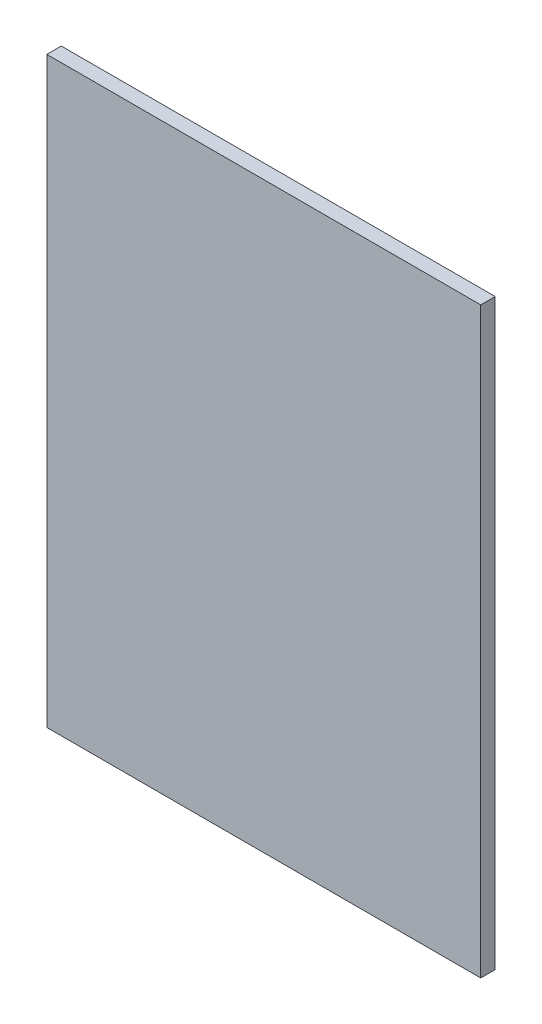
ISO-10303-21;
HEADER;
FILE_DESCRIPTION(('STEP AP214'),'2;1');
FILE_NAME('part.step','',(''),(''),'','','');
FILE_SCHEMA(('AUTOMOTIVE_DESIGN { 1 0 10303 214 1 1 1 1 }'));
ENDSEC;
DATA;
#1=APPLICATION_CONTEXT('core data for automotive mechanical design processes');
#2=APPLICATION_PROTOCOL_DEFINITION('international standard','automotive_design',2000,#1);
#3=PRODUCT_CONTEXT('',#1,'mechanical');
#4=PRODUCT('Part','Part','',(#3));
#5=PRODUCT_RELATED_PRODUCT_CATEGORY('part','',(#4));
#6=PRODUCT_DEFINITION_FORMATION('','',#4);
#7=PRODUCT_DEFINITION_CONTEXT('part definition',#1,'design');
#8=PRODUCT_DEFINITION('design','',#6,#7);
#9=PRODUCT_DEFINITION_SHAPE('','',#8);
#10=(LENGTH_UNIT() NAMED_UNIT(*) SI_UNIT(.MILLI.,.METRE.));
#11=(NAMED_UNIT(*) PLANE_ANGLE_UNIT() SI_UNIT($,.RADIAN.));
#12=(NAMED_UNIT(*) SI_UNIT($,.STERADIAN.) SOLID_ANGLE_UNIT());
#13=UNCERTAINTY_MEASURE_WITH_UNIT(LENGTH_MEASURE(1.E-05),#10,'distance_accuracy_value','');
#14=(GEOMETRIC_REPRESENTATION_CONTEXT(3) GLOBAL_UNCERTAINTY_ASSIGNED_CONTEXT((#13)) GLOBAL_UNIT_ASSIGNED_CONTEXT((#10,
#11,#12)) REPRESENTATION_CONTEXT('',''));
#15=CARTESIAN_POINT('',(0.,0.,0.));
#16=DIRECTION('',(0.,0.,1.));
#17=DIRECTION('',(1.,0.,0.));
#18=AXIS2_PLACEMENT_3D('',#15,#16,#17);
#19=CARTESIAN_POINT('',(-38.1,51.181,2.54));
#20=DIRECTION('',(1.,0.,0.));
#21=DIRECTION('',(0.,0.,-1.));
#22=AXIS2_PLACEMENT_3D('',#19,#20,#21);
#23=PLANE('',#22);
#24=DIRECTION('',(0.,-1.,0.));
#25=VECTOR('',#24,1.);
#26=CARTESIAN_POINT('',(-38.1,51.181,0.));
#27=LINE('',#26,#25);
#28=CARTESIAN_POINT('',(-38.1,51.181,0.));
#29=VERTEX_POINT('',#28);
#30=CARTESIAN_POINT('',(-38.1,-51.181,0.));
#31=VERTEX_POINT('',#30);
#32=EDGE_CURVE('E98',#29,#31,#27,.T.);
#33=ORIENTED_EDGE('',*,*,#32,.T.);
#34=DIRECTION('',(0.,0.,-1.));
#35=VECTOR('',#34,1.);
#36=CARTESIAN_POINT('',(-38.1,-51.181,2.54));
#37=LINE('',#36,#35);
#38=CARTESIAN_POINT('',(-38.1,-51.181,2.54));
#39=VERTEX_POINT('',#38);
#40=EDGE_CURVE('E11',#39,#31,#37,.T.);
#41=ORIENTED_EDGE('',*,*,#40,.F.);
#42=DIRECTION('',(0.,-1.,0.));
#43=VECTOR('',#42,1.);
#44=CARTESIAN_POINT('',(-38.1,51.181,2.54));
#45=LINE('',#44,#43);
#46=CARTESIAN_POINT('',(-38.1,51.181,2.54));
#47=VERTEX_POINT('',#46);
#48=EDGE_CURVE('E86',#47,#39,#45,.T.);
#49=ORIENTED_EDGE('',*,*,#48,.F.);
#50=DIRECTION('',(0.,0.,-1.));
#51=VECTOR('',#50,1.);
#52=CARTESIAN_POINT('',(-38.1,51.181,2.54));
#53=LINE('',#52,#51);
#54=EDGE_CURVE('E94',#47,#29,#53,.T.);
#55=ORIENTED_EDGE('',*,*,#54,.T.);
#56=EDGE_LOOP('',(#33,#41,#49,#55));
#57=FACE_BOUND('',#56,.T.);
#58=ADVANCED_FACE('F35',(#57),#23,.F.);
#59=CARTESIAN_POINT('',(-38.1,-51.181,2.54));
#60=DIRECTION('',(0.,1.,0.));
#61=DIRECTION('',(-1.,0.,0.));
#62=AXIS2_PLACEMENT_3D('',#59,#60,#61);
#63=PLANE('',#62);
#64=DIRECTION('',(1.,0.,0.));
#65=VECTOR('',#64,1.);
#66=CARTESIAN_POINT('',(-38.1,-51.181,0.));
#67=LINE('',#66,#65);
#68=CARTESIAN_POINT('',(38.1,-51.181,0.));
#69=VERTEX_POINT('',#68);
#70=EDGE_CURVE('E90',#31,#69,#67,.T.);
#71=ORIENTED_EDGE('',*,*,#70,.T.);
#72=DIRECTION('',(0.,0.,-1.));
#73=VECTOR('',#72,1.);
#74=CARTESIAN_POINT('',(38.1,-51.181,2.54));
#75=LINE('',#74,#73);
#76=CARTESIAN_POINT('',(38.1,-51.181,2.54));
#77=VERTEX_POINT('',#76);
#78=EDGE_CURVE('E43',#77,#69,#75,.T.);
#79=ORIENTED_EDGE('',*,*,#78,.F.);
#80=DIRECTION('',(1.,0.,0.));
#81=VECTOR('',#80,1.);
#82=CARTESIAN_POINT('',(-38.1,-51.181,2.54));
#83=LINE('',#82,#81);
#84=EDGE_CURVE('E81',#39,#77,#83,.T.);
#85=ORIENTED_EDGE('',*,*,#84,.F.);
#86=ORIENTED_EDGE('',*,*,#40,.T.);
#87=EDGE_LOOP('',(#71,#79,#85,#86));
#88=FACE_BOUND('',#87,.T.);
#89=ADVANCED_FACE('F89',(#88),#63,.F.);
#90=CARTESIAN_POINT('',(38.1,51.181,2.54));
#91=DIRECTION('',(-1.,0.,0.));
#92=DIRECTION('',(0.,0.,1.));
#93=AXIS2_PLACEMENT_3D('',#90,#91,#92);
#94=PLANE('',#93);
#95=DIRECTION('',(0.,1.,0.));
#96=VECTOR('',#95,1.);
#97=CARTESIAN_POINT('',(38.1,51.181,0.));
#98=LINE('',#97,#96);
#99=CARTESIAN_POINT('',(38.1,51.181,0.));
#100=VERTEX_POINT('',#99);
#101=EDGE_CURVE('E68',#69,#100,#98,.T.);
#102=ORIENTED_EDGE('',*,*,#101,.T.);
#103=DIRECTION('',(0.,0.,-1.));
#104=VECTOR('',#103,1.);
#105=CARTESIAN_POINT('',(38.1,51.181,2.54));
#106=LINE('',#105,#104);
#107=CARTESIAN_POINT('',(38.1,51.181,2.54));
#108=VERTEX_POINT('',#107);
#109=EDGE_CURVE('E91',#108,#100,#106,.T.);
#110=ORIENTED_EDGE('',*,*,#109,.F.);
#111=DIRECTION('',(0.,1.,0.));
#112=VECTOR('',#111,1.);
#113=CARTESIAN_POINT('',(38.1,51.181,2.54));
#114=LINE('',#113,#112);
#115=EDGE_CURVE('E84',#77,#108,#114,.T.);
#116=ORIENTED_EDGE('',*,*,#115,.F.);
#117=ORIENTED_EDGE('',*,*,#78,.T.);
#118=EDGE_LOOP('',(#102,#110,#116,#117));
#119=FACE_BOUND('',#118,.T.);
#120=ADVANCED_FACE('F92',(#119),#94,.F.);
#121=CARTESIAN_POINT('',(-38.1,51.181,2.54));
#122=DIRECTION('',(0.,-1.,0.));
#123=DIRECTION('',(1.,0.,0.));
#124=AXIS2_PLACEMENT_3D('',#121,#122,#123);
#125=PLANE('',#124);
#126=DIRECTION('',(-1.,0.,0.));
#127=VECTOR('',#126,1.);
#128=CARTESIAN_POINT('',(-38.1,51.181,0.));
#129=LINE('',#128,#127);
#130=EDGE_CURVE('E74',#100,#29,#129,.T.);
#131=ORIENTED_EDGE('',*,*,#130,.T.);
#132=ORIENTED_EDGE('',*,*,#54,.F.);
#133=DIRECTION('',(-1.,0.,0.));
#134=VECTOR('',#133,1.);
#135=CARTESIAN_POINT('',(-38.1,51.181,2.54));
#136=LINE('',#135,#134);
#137=EDGE_CURVE('E51',#108,#47,#136,.T.);
#138=ORIENTED_EDGE('',*,*,#137,.F.);
#139=ORIENTED_EDGE('',*,*,#109,.T.);
#140=EDGE_LOOP('',(#131,#132,#138,#139));
#141=FACE_BOUND('',#140,.T.);
#142=ADVANCED_FACE('F105',(#141),#125,.F.);
#143=CARTESIAN_POINT('',(0.,0.,2.54));
#144=DIRECTION('',(0.,0.,1.));
#145=DIRECTION('',(1.,0.,0.));
#146=AXIS2_PLACEMENT_3D('',#143,#144,#145);
#147=PLANE('',#146);
#148=ORIENTED_EDGE('',*,*,#48,.T.);
#149=ORIENTED_EDGE('',*,*,#84,.T.);
#150=ORIENTED_EDGE('',*,*,#115,.T.);
#151=ORIENTED_EDGE('',*,*,#137,.T.);
#152=EDGE_LOOP('',(#148,#149,#150,#151));
#153=FACE_BOUND('',#152,.T.);
#154=ADVANCED_FACE('F82',(#153),#147,.T.);
#155=CARTESIAN_POINT('',(0.,0.,0.));
#156=DIRECTION('',(0.,0.,1.));
#157=DIRECTION('',(1.,0.,0.));
#158=AXIS2_PLACEMENT_3D('',#155,#156,#157);
#159=PLANE('',#158);
#160=ORIENTED_EDGE('',*,*,#32,.F.);
#161=ORIENTED_EDGE('',*,*,#130,.F.);
#162=ORIENTED_EDGE('',*,*,#101,.F.);
#163=ORIENTED_EDGE('',*,*,#70,.F.);
#164=EDGE_LOOP('',(#160,#161,#162,#163));
#165=FACE_BOUND('',#164,.T.);
#166=ADVANCED_FACE('F108',(#165),#159,.F.);
#167=CLOSED_SHELL('',(#58,#89,#120,#142,#154,#166));
#168=MANIFOLD_SOLID_BREP('B2',#167);
#169=ADVANCED_BREP_SHAPE_REPRESENTATION('',(#18,#168),#14);
#170=SHAPE_DEFINITION_REPRESENTATION(#9,#169);
ENDSEC;
END-ISO-10303-21;
